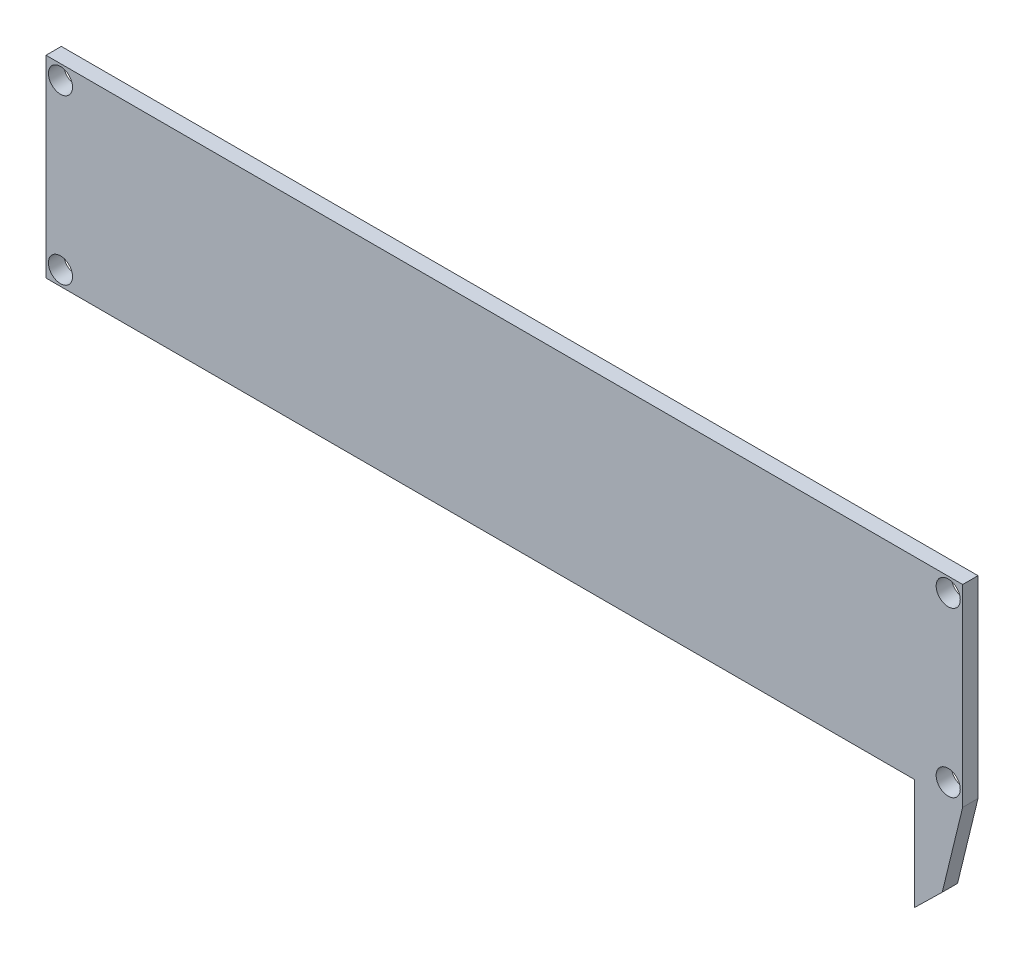
ISO-10303-21;
HEADER;
FILE_DESCRIPTION(('STEP AP214'),'2;1');
FILE_NAME('part.step','',(''),(''),'','','');
FILE_SCHEMA(('AUTOMOTIVE_DESIGN { 1 0 10303 214 1 1 1 1 }'));
ENDSEC;
DATA;
#1=APPLICATION_CONTEXT('core data for automotive mechanical design processes');
#2=APPLICATION_PROTOCOL_DEFINITION('international standard','automotive_design',2000,#1);
#3=PRODUCT_CONTEXT('',#1,'mechanical');
#4=PRODUCT('Part','Part','',(#3));
#5=PRODUCT_RELATED_PRODUCT_CATEGORY('part','',(#4));
#6=PRODUCT_DEFINITION_FORMATION('','',#4);
#7=PRODUCT_DEFINITION_CONTEXT('part definition',#1,'design');
#8=PRODUCT_DEFINITION('design','',#6,#7);
#9=PRODUCT_DEFINITION_SHAPE('','',#8);
#10=(LENGTH_UNIT() NAMED_UNIT(*) SI_UNIT(.MILLI.,.METRE.));
#11=(NAMED_UNIT(*) PLANE_ANGLE_UNIT() SI_UNIT($,.RADIAN.));
#12=(NAMED_UNIT(*) SI_UNIT($,.STERADIAN.) SOLID_ANGLE_UNIT());
#13=UNCERTAINTY_MEASURE_WITH_UNIT(LENGTH_MEASURE(1.E-05),#10,'distance_accuracy_value','');
#14=(GEOMETRIC_REPRESENTATION_CONTEXT(3) GLOBAL_UNCERTAINTY_ASSIGNED_CONTEXT((#13)) GLOBAL_UNIT_ASSIGNED_CONTEXT((#10,
#11,#12)) REPRESENTATION_CONTEXT('',''));
#15=CARTESIAN_POINT('',(0.,0.,0.));
#16=DIRECTION('',(0.,0.,1.));
#17=DIRECTION('',(1.,0.,0.));
#18=AXIS2_PLACEMENT_3D('',#15,#16,#17);
#19=CARTESIAN_POINT('',(0.,0.,3.175));
#20=DIRECTION('',(1.,0.,0.));
#21=DIRECTION('',(0.,0.,-1.));
#22=AXIS2_PLACEMENT_3D('',#19,#20,#21);
#23=PLANE('',#22);
#24=DIRECTION('',(0.,-1.,0.));
#25=VECTOR('',#24,1.);
#26=CARTESIAN_POINT('',(0.,0.,0.));
#27=LINE('',#26,#25);
#28=CARTESIAN_POINT('',(0.,40.,0.));
#29=VERTEX_POINT('',#28);
#30=CARTESIAN_POINT('',(0.,0.,0.));
#31=VERTEX_POINT('',#30);
#32=EDGE_CURVE('E119',#29,#31,#27,.T.);
#33=ORIENTED_EDGE('',*,*,#32,.T.);
#34=DIRECTION('',(0.,0.,-1.));
#35=VECTOR('',#34,1.);
#36=CARTESIAN_POINT('',(0.,0.,3.175));
#37=LINE('',#36,#35);
#38=CARTESIAN_POINT('',(0.,0.,3.175));
#39=VERTEX_POINT('',#38);
#40=EDGE_CURVE('E11',#39,#31,#37,.T.);
#41=ORIENTED_EDGE('',*,*,#40,.F.);
#42=DIRECTION('',(0.,-1.,0.));
#43=VECTOR('',#42,1.);
#44=CARTESIAN_POINT('',(0.,0.,3.175));
#45=LINE('',#44,#43);
#46=CARTESIAN_POINT('',(0.,40.,3.175));
#47=VERTEX_POINT('',#46);
#48=EDGE_CURVE('E133',#47,#39,#45,.T.);
#49=ORIENTED_EDGE('',*,*,#48,.F.);
#50=DIRECTION('',(0.,0.,-1.));
#51=VECTOR('',#50,1.);
#52=CARTESIAN_POINT('',(0.,40.,3.175));
#53=LINE('',#52,#51);
#54=EDGE_CURVE('E134',#47,#29,#53,.T.);
#55=ORIENTED_EDGE('',*,*,#54,.T.);
#56=EDGE_LOOP('',(#33,#41,#49,#55));
#57=FACE_BOUND('',#56,.T.);
#58=ADVANCED_FACE('F33',(#57),#23,.F.);
#59=CARTESIAN_POINT('',(0.,0.,3.175));
#60=DIRECTION('',(0.,1.,0.));
#61=DIRECTION('',(0.,0.,1.));
#62=AXIS2_PLACEMENT_3D('',#59,#60,#61);
#63=PLANE('',#62);
#64=DIRECTION('',(1.,0.,0.));
#65=VECTOR('',#64,1.);
#66=CARTESIAN_POINT('',(0.,0.,0.));
#67=LINE('',#66,#65);
#68=CARTESIAN_POINT('',(180.,0.,0.));
#69=VERTEX_POINT('',#68);
#70=EDGE_CURVE('E106',#31,#69,#67,.T.);
#71=ORIENTED_EDGE('',*,*,#70,.T.);
#72=DIRECTION('',(0.,0.,1.));
#73=VECTOR('',#72,1.);
#74=CARTESIAN_POINT('',(180.,0.,-25.0798724079689));
#75=LINE('',#74,#73);
#76=CARTESIAN_POINT('',(180.,0.,3.175));
#77=VERTEX_POINT('',#76);
#78=EDGE_CURVE('E111',#69,#77,#75,.T.);
#79=ORIENTED_EDGE('',*,*,#78,.T.);
#80=DIRECTION('',(1.,0.,0.));
#81=VECTOR('',#80,1.);
#82=CARTESIAN_POINT('',(0.,0.,3.175));
#83=LINE('',#82,#81);
#84=EDGE_CURVE('E80',#39,#77,#83,.T.);
#85=ORIENTED_EDGE('',*,*,#84,.F.);
#86=ORIENTED_EDGE('',*,*,#40,.T.);
#87=EDGE_LOOP('',(#71,#79,#85,#86));
#88=FACE_BOUND('',#87,.T.);
#89=ADVANCED_FACE('F115',(#88),#63,.F.);
#90=CARTESIAN_POINT('',(190.,0.,3.175));
#91=DIRECTION('',(-1.,0.,0.));
#92=DIRECTION('',(0.,0.,1.));
#93=AXIS2_PLACEMENT_3D('',#90,#91,#92);
#94=PLANE('',#93);
#95=DIRECTION('',(0.,1.,0.));
#96=VECTOR('',#95,1.);
#97=CARTESIAN_POINT('',(190.,0.,0.));
#98=LINE('',#97,#96);
#99=CARTESIAN_POINT('',(190.,0.,0.));
#100=VERTEX_POINT('',#99);
#101=CARTESIAN_POINT('',(190.,40.,0.));
#102=VERTEX_POINT('',#101);
#103=EDGE_CURVE('E118',#100,#102,#98,.T.);
#104=ORIENTED_EDGE('',*,*,#103,.T.);
#105=DIRECTION('',(0.,0.,-1.));
#106=VECTOR('',#105,1.);
#107=CARTESIAN_POINT('',(190.,40.,3.175));
#108=LINE('',#107,#106);
#109=CARTESIAN_POINT('',(190.,40.,3.175));
#110=VERTEX_POINT('',#109);
#111=EDGE_CURVE('E136',#110,#102,#108,.T.);
#112=ORIENTED_EDGE('',*,*,#111,.F.);
#113=DIRECTION('',(0.,1.,0.));
#114=VECTOR('',#113,1.);
#115=CARTESIAN_POINT('',(190.,0.,3.175));
#116=LINE('',#115,#114);
#117=CARTESIAN_POINT('',(190.,0.,3.175));
#118=VERTEX_POINT('',#117);
#119=EDGE_CURVE('E143',#118,#110,#116,.T.);
#120=ORIENTED_EDGE('',*,*,#119,.F.);
#121=DIRECTION('',(0.,0.,-1.));
#122=VECTOR('',#121,1.);
#123=CARTESIAN_POINT('',(190.,0.,3.175));
#124=LINE('',#123,#122);
#125=EDGE_CURVE('E41',#118,#100,#124,.T.);
#126=ORIENTED_EDGE('',*,*,#125,.T.);
#127=EDGE_LOOP('',(#104,#112,#120,#126));
#128=FACE_BOUND('',#127,.T.);
#129=ADVANCED_FACE('F141',(#128),#94,.F.);
#130=CARTESIAN_POINT('',(0.,40.,3.175));
#131=DIRECTION('',(0.,-1.,0.));
#132=DIRECTION('',(0.,0.,-1.));
#133=AXIS2_PLACEMENT_3D('',#130,#131,#132);
#134=PLANE('',#133);
#135=DIRECTION('',(-1.,0.,0.));
#136=VECTOR('',#135,1.);
#137=CARTESIAN_POINT('',(0.,40.,0.));
#138=LINE('',#137,#136);
#139=EDGE_CURVE('E75',#102,#29,#138,.T.);
#140=ORIENTED_EDGE('',*,*,#139,.T.);
#141=ORIENTED_EDGE('',*,*,#54,.F.);
#142=DIRECTION('',(-1.,0.,0.));
#143=VECTOR('',#142,1.);
#144=CARTESIAN_POINT('',(0.,40.,3.175));
#145=LINE('',#144,#143);
#146=EDGE_CURVE('E58',#110,#47,#145,.T.);
#147=ORIENTED_EDGE('',*,*,#146,.F.);
#148=ORIENTED_EDGE('',*,*,#111,.T.);
#149=EDGE_LOOP('',(#140,#141,#147,#148));
#150=FACE_BOUND('',#149,.T.);
#151=ADVANCED_FACE('F151',(#150),#134,.F.);
#152=CARTESIAN_POINT('',(0.,0.,3.175));
#153=DIRECTION('',(0.,0.,-1.));
#154=DIRECTION('',(-1.,0.,0.));
#155=AXIS2_PLACEMENT_3D('',#152,#153,#154);
#156=PLANE('',#155);
#157=CARTESIAN_POINT('',(187.,3.,3.175));
#158=DIRECTION('',(0.,0.,1.));
#159=DIRECTION('',(1.,0.,0.));
#160=AXIS2_PLACEMENT_3D('',#157,#158,#159);
#161=CIRCLE('',#160,2.5);
#162=CARTESIAN_POINT('',(189.5,3.,3.175));
#163=VERTEX_POINT('',#162);
#164=EDGE_CURVE('E174',#163,#163,#161,.T.);
#165=ORIENTED_EDGE('',*,*,#164,.F.);
#166=EDGE_LOOP('',(#165));
#167=FACE_BOUND('',#166,.T.);
#168=CARTESIAN_POINT('',(187.,37.,3.175));
#169=DIRECTION('',(0.,0.,1.));
#170=DIRECTION('',(1.,0.,0.));
#171=AXIS2_PLACEMENT_3D('',#168,#169,#170);
#172=CIRCLE('',#171,2.5);
#173=CARTESIAN_POINT('',(189.5,37.,3.175));
#174=VERTEX_POINT('',#173);
#175=EDGE_CURVE('E168',#174,#174,#172,.T.);
#176=ORIENTED_EDGE('',*,*,#175,.F.);
#177=EDGE_LOOP('',(#176));
#178=FACE_BOUND('',#177,.T.);
#179=CARTESIAN_POINT('',(3.00000000000034,3.,3.175));
#180=DIRECTION('',(0.,0.,1.));
#181=DIRECTION('',(1.,0.,0.));
#182=AXIS2_PLACEMENT_3D('',#179,#180,#181);
#183=CIRCLE('',#182,2.5);
#184=CARTESIAN_POINT('',(5.50000000000034,3.,3.175));
#185=VERTEX_POINT('',#184);
#186=EDGE_CURVE('E162',#185,#185,#183,.T.);
#187=ORIENTED_EDGE('',*,*,#186,.F.);
#188=EDGE_LOOP('',(#187));
#189=FACE_BOUND('',#188,.T.);
#190=CARTESIAN_POINT('',(3.,37.,3.175));
#191=DIRECTION('',(0.,0.,1.));
#192=DIRECTION('',(1.,0.,0.));
#193=AXIS2_PLACEMENT_3D('',#190,#191,#192);
#194=CIRCLE('',#193,2.5);
#195=CARTESIAN_POINT('',(5.50000000000001,37.,3.175));
#196=VERTEX_POINT('',#195);
#197=EDGE_CURVE('E156',#196,#196,#194,.T.);
#198=ORIENTED_EDGE('',*,*,#197,.F.);
#199=EDGE_LOOP('',(#198));
#200=FACE_BOUND('',#199,.T.);
#201=ORIENTED_EDGE('',*,*,#48,.T.);
#202=ORIENTED_EDGE('',*,*,#84,.T.);
#203=DIRECTION('',(0.,-1.,0.));
#204=VECTOR('',#203,1.);
#205=CARTESIAN_POINT('',(180.,0.,3.175));
#206=LINE('',#205,#204);
#207=CARTESIAN_POINT('',(180.,-23.,3.175));
#208=VERTEX_POINT('',#207);
#209=EDGE_CURVE('E49',#77,#208,#206,.T.);
#210=ORIENTED_EDGE('',*,*,#209,.T.);
#211=DIRECTION('',(0.714798854486101,0.699330106334167,0.));
#212=VECTOR('',#211,1.);
#213=CARTESIAN_POINT('',(180.,-23.,3.175));
#214=LINE('',#213,#212);
#215=CARTESIAN_POINT('',(185.764662442974,-17.3600888922465,3.175));
#216=VERTEX_POINT('',#215);
#217=EDGE_CURVE('E113',#208,#216,#214,.T.);
#218=ORIENTED_EDGE('',*,*,#217,.T.);
#219=DIRECTION('',(0.237017954328429,0.971505269839524,0.));
#220=VECTOR('',#219,1.);
#221=CARTESIAN_POINT('',(185.764662442974,-17.3600888922465,3.175));
#222=LINE('',#221,#220);
#223=EDGE_CURVE('E184',#216,#118,#222,.T.);
#224=ORIENTED_EDGE('',*,*,#223,.T.);
#225=ORIENTED_EDGE('',*,*,#119,.T.);
#226=ORIENTED_EDGE('',*,*,#146,.T.);
#227=EDGE_LOOP('',(#201,#202,#210,#218,#224,#225,#226));
#228=FACE_BOUND('',#227,.T.);
#229=ADVANCED_FACE('F195',(#167,#178,#189,#200,#228),#156,.F.);
#230=CARTESIAN_POINT('',(0.,0.,0.));
#231=DIRECTION('',(0.,0.,-1.));
#232=DIRECTION('',(-1.,0.,0.));
#233=AXIS2_PLACEMENT_3D('',#230,#231,#232);
#234=PLANE('',#233);
#235=CARTESIAN_POINT('',(187.,3.,0.));
#236=DIRECTION('',(0.,0.,1.));
#237=DIRECTION('',(1.,0.,0.));
#238=AXIS2_PLACEMENT_3D('',#235,#236,#237);
#239=CIRCLE('',#238,2.5);
#240=CARTESIAN_POINT('',(189.5,3.,0.));
#241=VERTEX_POINT('',#240);
#242=EDGE_CURVE('E171',#241,#241,#239,.T.);
#243=ORIENTED_EDGE('',*,*,#242,.T.);
#244=EDGE_LOOP('',(#243));
#245=FACE_BOUND('',#244,.T.);
#246=CARTESIAN_POINT('',(187.,37.,0.));
#247=DIRECTION('',(0.,0.,1.));
#248=DIRECTION('',(1.,0.,0.));
#249=AXIS2_PLACEMENT_3D('',#246,#247,#248);
#250=CIRCLE('',#249,2.5);
#251=CARTESIAN_POINT('',(189.5,37.,0.));
#252=VERTEX_POINT('',#251);
#253=EDGE_CURVE('E165',#252,#252,#250,.T.);
#254=ORIENTED_EDGE('',*,*,#253,.T.);
#255=EDGE_LOOP('',(#254));
#256=FACE_BOUND('',#255,.T.);
#257=CARTESIAN_POINT('',(3.00000000000034,3.,0.));
#258=DIRECTION('',(0.,0.,1.));
#259=DIRECTION('',(1.,0.,0.));
#260=AXIS2_PLACEMENT_3D('',#257,#258,#259);
#261=CIRCLE('',#260,2.5);
#262=CARTESIAN_POINT('',(5.50000000000034,3.,0.));
#263=VERTEX_POINT('',#262);
#264=EDGE_CURVE('E159',#263,#263,#261,.T.);
#265=ORIENTED_EDGE('',*,*,#264,.T.);
#266=EDGE_LOOP('',(#265));
#267=FACE_BOUND('',#266,.T.);
#268=CARTESIAN_POINT('',(3.,37.,0.));
#269=DIRECTION('',(0.,0.,1.));
#270=DIRECTION('',(1.,0.,0.));
#271=AXIS2_PLACEMENT_3D('',#268,#269,#270);
#272=CIRCLE('',#271,2.5);
#273=CARTESIAN_POINT('',(5.50000000000001,37.,0.));
#274=VERTEX_POINT('',#273);
#275=EDGE_CURVE('E122',#274,#274,#272,.T.);
#276=ORIENTED_EDGE('',*,*,#275,.T.);
#277=EDGE_LOOP('',(#276));
#278=FACE_BOUND('',#277,.T.);
#279=ORIENTED_EDGE('',*,*,#32,.F.);
#280=ORIENTED_EDGE('',*,*,#139,.F.);
#281=ORIENTED_EDGE('',*,*,#103,.F.);
#282=DIRECTION('',(0.237017954328429,0.971505269839524,0.));
#283=VECTOR('',#282,1.);
#284=CARTESIAN_POINT('',(185.764662442974,-17.3600888922465,0.));
#285=LINE('',#284,#283);
#286=CARTESIAN_POINT('',(185.764662442974,-17.3600888922465,0.));
#287=VERTEX_POINT('',#286);
#288=EDGE_CURVE('E147',#287,#100,#285,.T.);
#289=ORIENTED_EDGE('',*,*,#288,.F.);
#290=DIRECTION('',(0.714798854486101,0.699330106334167,0.));
#291=VECTOR('',#290,1.);
#292=CARTESIAN_POINT('',(180.,-23.,0.));
#293=LINE('',#292,#291);
#294=CARTESIAN_POINT('',(180.,-23.,0.));
#295=VERTEX_POINT('',#294);
#296=EDGE_CURVE('E108',#295,#287,#293,.T.);
#297=ORIENTED_EDGE('',*,*,#296,.F.);
#298=DIRECTION('',(0.,-1.,0.));
#299=VECTOR('',#298,1.);
#300=CARTESIAN_POINT('',(180.,0.,0.));
#301=LINE('',#300,#299);
#302=EDGE_CURVE('E102',#69,#295,#301,.T.);
#303=ORIENTED_EDGE('',*,*,#302,.F.);
#304=ORIENTED_EDGE('',*,*,#70,.F.);
#305=EDGE_LOOP('',(#279,#280,#281,#289,#297,#303,#304));
#306=FACE_BOUND('',#305,.T.);
#307=ADVANCED_FACE('F104',(#245,#256,#267,#278,#306),#234,.T.);
#308=CARTESIAN_POINT('',(3.,37.,0.));
#309=DIRECTION('',(0.,0.,1.));
#310=DIRECTION('',(1.,0.,0.));
#311=AXIS2_PLACEMENT_3D('',#308,#309,#310);
#312=CYLINDRICAL_SURFACE('',#311,2.5);
#313=ORIENTED_EDGE('',*,*,#275,.F.);
#314=EDGE_LOOP('',(#313));
#315=FACE_BOUND('',#314,.T.);
#316=ORIENTED_EDGE('',*,*,#197,.T.);
#317=EDGE_LOOP('',(#316));
#318=FACE_BOUND('',#317,.T.);
#319=ADVANCED_FACE('F203',(#315,#318),#312,.F.);
#320=CARTESIAN_POINT('',(3.00000000000034,3.,0.));
#321=DIRECTION('',(0.,0.,1.));
#322=DIRECTION('',(1.,0.,0.));
#323=AXIS2_PLACEMENT_3D('',#320,#321,#322);
#324=CYLINDRICAL_SURFACE('',#323,2.5);
#325=ORIENTED_EDGE('',*,*,#264,.F.);
#326=EDGE_LOOP('',(#325));
#327=FACE_BOUND('',#326,.T.);
#328=ORIENTED_EDGE('',*,*,#186,.T.);
#329=EDGE_LOOP('',(#328));
#330=FACE_BOUND('',#329,.T.);
#331=ADVANCED_FACE('F236',(#327,#330),#324,.F.);
#332=CARTESIAN_POINT('',(187.,37.,0.));
#333=DIRECTION('',(0.,0.,1.));
#334=DIRECTION('',(1.,0.,0.));
#335=AXIS2_PLACEMENT_3D('',#332,#333,#334);
#336=CYLINDRICAL_SURFACE('',#335,2.5);
#337=ORIENTED_EDGE('',*,*,#253,.F.);
#338=EDGE_LOOP('',(#337));
#339=FACE_BOUND('',#338,.T.);
#340=ORIENTED_EDGE('',*,*,#175,.T.);
#341=EDGE_LOOP('',(#340));
#342=FACE_BOUND('',#341,.T.);
#343=ADVANCED_FACE('F246',(#339,#342),#336,.F.);
#344=CARTESIAN_POINT('',(187.,3.,0.));
#345=DIRECTION('',(0.,0.,1.));
#346=DIRECTION('',(1.,0.,0.));
#347=AXIS2_PLACEMENT_3D('',#344,#345,#346);
#348=CYLINDRICAL_SURFACE('',#347,2.5);
#349=ORIENTED_EDGE('',*,*,#242,.F.);
#350=EDGE_LOOP('',(#349));
#351=FACE_BOUND('',#350,.T.);
#352=ORIENTED_EDGE('',*,*,#164,.T.);
#353=EDGE_LOOP('',(#352));
#354=FACE_BOUND('',#353,.T.);
#355=ADVANCED_FACE('F256',(#351,#354),#348,.F.);
#356=CARTESIAN_POINT('',(180.,0.,-25.0798724079689));
#357=DIRECTION('',(-1.,0.,0.));
#358=DIRECTION('',(0.,0.,1.));
#359=AXIS2_PLACEMENT_3D('',#356,#357,#358);
#360=PLANE('',#359);
#361=ORIENTED_EDGE('',*,*,#78,.F.);
#362=ORIENTED_EDGE('',*,*,#302,.T.);
#363=DIRECTION('',(0.,0.,1.));
#364=VECTOR('',#363,1.);
#365=CARTESIAN_POINT('',(180.,-23.,-25.0798724079689));
#366=LINE('',#365,#364);
#367=EDGE_CURVE('E110',#295,#208,#366,.T.);
#368=ORIENTED_EDGE('',*,*,#367,.T.);
#369=ORIENTED_EDGE('',*,*,#209,.F.);
#370=EDGE_LOOP('',(#361,#362,#368,#369));
#371=FACE_BOUND('',#370,.T.);
#372=ADVANCED_FACE('F112',(#371),#360,.T.);
#373=CARTESIAN_POINT('',(180.,-23.,-25.0798724079689));
#374=DIRECTION('',(0.699330106334167,-0.714798854486101,0.));
#375=DIRECTION('',(0.714798854486101,0.699330106334167,0.));
#376=AXIS2_PLACEMENT_3D('',#373,#374,#375);
#377=PLANE('',#376);
#378=ORIENTED_EDGE('',*,*,#367,.F.);
#379=ORIENTED_EDGE('',*,*,#296,.T.);
#380=DIRECTION('',(0.,0.,1.));
#381=VECTOR('',#380,1.);
#382=CARTESIAN_POINT('',(185.764662442974,-17.3600888922465,-25.0798724079689));
#383=LINE('',#382,#381);
#384=EDGE_CURVE('E191',#287,#216,#383,.T.);
#385=ORIENTED_EDGE('',*,*,#384,.T.);
#386=ORIENTED_EDGE('',*,*,#217,.F.);
#387=EDGE_LOOP('',(#378,#379,#385,#386));
#388=FACE_BOUND('',#387,.T.);
#389=ADVANCED_FACE('F193',(#388),#377,.T.);
#390=CARTESIAN_POINT('',(185.764662442974,-17.3600888922465,-25.0798724079689));
#391=DIRECTION('',(0.971505269839524,-0.237017954328429,0.));
#392=DIRECTION('',(0.237017954328429,0.971505269839524,0.));
#393=AXIS2_PLACEMENT_3D('',#390,#391,#392);
#394=PLANE('',#393);
#395=ORIENTED_EDGE('',*,*,#384,.F.);
#396=ORIENTED_EDGE('',*,*,#288,.T.);
#397=ORIENTED_EDGE('',*,*,#125,.F.);
#398=ORIENTED_EDGE('',*,*,#223,.F.);
#399=EDGE_LOOP('',(#395,#396,#397,#398));
#400=FACE_BOUND('',#399,.T.);
#401=ADVANCED_FACE('F194',(#400),#394,.T.);
#402=CLOSED_SHELL('',(#58,#89,#129,#151,#229,#307,#319,#331,#343,#355,#372,#389,#401));
#403=MANIFOLD_SOLID_BREP('B2',#402);
#404=ADVANCED_BREP_SHAPE_REPRESENTATION('',(#18,#403),#14);
#405=SHAPE_DEFINITION_REPRESENTATION(#9,#404);
ENDSEC;
END-ISO-10303-21;
